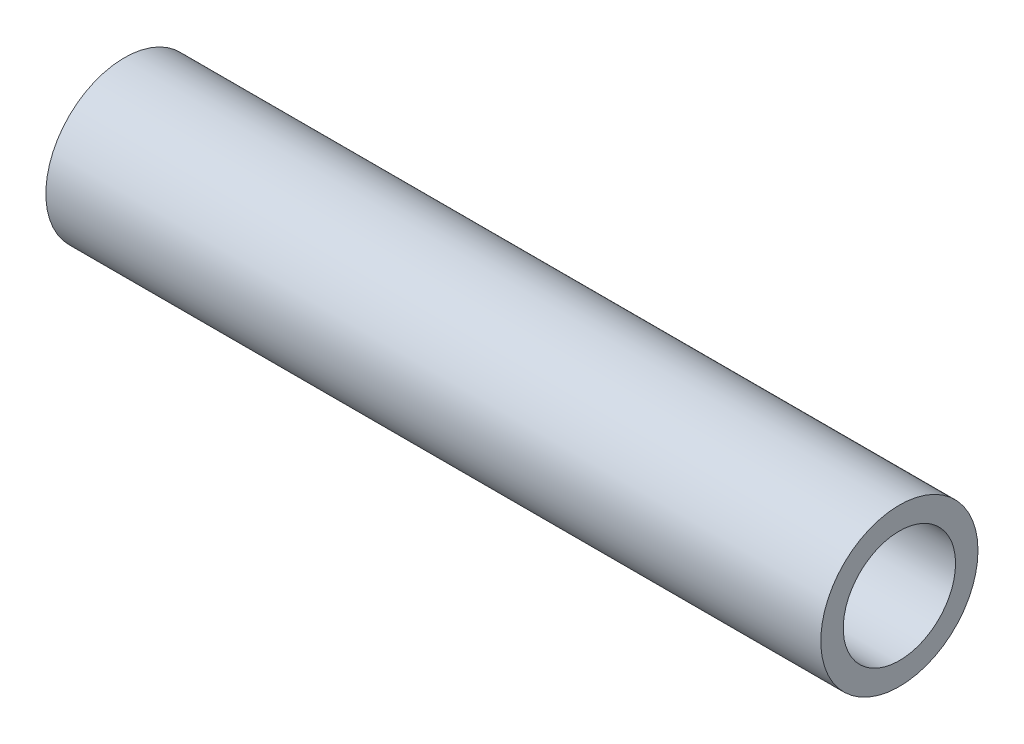
ISO-10303-21;
HEADER;
FILE_DESCRIPTION(('STEP AP214'),'2;1');
FILE_NAME('part.step','',(''),(''),'','','');
FILE_SCHEMA(('AUTOMOTIVE_DESIGN { 1 0 10303 214 1 1 1 1 }'));
ENDSEC;
DATA;
#1=APPLICATION_CONTEXT('core data for automotive mechanical design processes');
#2=APPLICATION_PROTOCOL_DEFINITION('international standard','automotive_design',2000,#1);
#3=PRODUCT_CONTEXT('',#1,'mechanical');
#4=PRODUCT('Part','Part','',(#3));
#5=PRODUCT_RELATED_PRODUCT_CATEGORY('part','',(#4));
#6=PRODUCT_DEFINITION_FORMATION('','',#4);
#7=PRODUCT_DEFINITION_CONTEXT('part definition',#1,'design');
#8=PRODUCT_DEFINITION('design','',#6,#7);
#9=PRODUCT_DEFINITION_SHAPE('','',#8);
#10=(LENGTH_UNIT() NAMED_UNIT(*) SI_UNIT(.MILLI.,.METRE.));
#11=(NAMED_UNIT(*) PLANE_ANGLE_UNIT() SI_UNIT($,.RADIAN.));
#12=(NAMED_UNIT(*) SI_UNIT($,.STERADIAN.) SOLID_ANGLE_UNIT());
#13=UNCERTAINTY_MEASURE_WITH_UNIT(LENGTH_MEASURE(1.E-05),#10,'distance_accuracy_value','');
#14=(GEOMETRIC_REPRESENTATION_CONTEXT(3) GLOBAL_UNCERTAINTY_ASSIGNED_CONTEXT((#13)) GLOBAL_UNIT_ASSIGNED_CONTEXT((#10,
#11,#12)) REPRESENTATION_CONTEXT('',''));
#15=CARTESIAN_POINT('',(0.,0.,0.));
#16=DIRECTION('',(0.,0.,1.));
#17=DIRECTION('',(1.,0.,0.));
#18=AXIS2_PLACEMENT_3D('',#15,#16,#17);
#19=CARTESIAN_POINT('',(69.,0.,0.));
#20=DIRECTION('',(1.,0.,0.));
#21=DIRECTION('',(0.,0.,-1.));
#22=AXIS2_PLACEMENT_3D('',#19,#20,#21);
#23=PLANE('',#22);
#24=CARTESIAN_POINT('',(69.,0.,0.));
#25=DIRECTION('',(1.,0.,0.));
#26=DIRECTION('',(0.,0.,-1.));
#27=AXIS2_PLACEMENT_3D('',#24,#25,#26);
#28=CIRCLE('',#27,7.);
#29=CARTESIAN_POINT('',(69.,0.,-7.));
#30=VERTEX_POINT('',#29);
#31=EDGE_CURVE('E10',#30,#30,#28,.T.);
#32=ORIENTED_EDGE('',*,*,#31,.T.);
#33=EDGE_LOOP('',(#32));
#34=FACE_BOUND('',#33,.T.);
#35=CARTESIAN_POINT('',(69.,0.,0.));
#36=DIRECTION('',(1.,0.,0.));
#37=DIRECTION('',(0.,0.,-1.));
#38=AXIS2_PLACEMENT_3D('',#35,#36,#37);
#39=CIRCLE('',#38,5.);
#40=CARTESIAN_POINT('',(69.,0.,-5.));
#41=VERTEX_POINT('',#40);
#42=EDGE_CURVE('E48',#41,#41,#39,.T.);
#43=ORIENTED_EDGE('',*,*,#42,.F.);
#44=EDGE_LOOP('',(#43));
#45=FACE_BOUND('',#44,.T.);
#46=ADVANCED_FACE('F37',(#34,#45),#23,.T.);
#47=CARTESIAN_POINT('',(0.,0.,0.));
#48=DIRECTION('',(1.,0.,0.));
#49=DIRECTION('',(0.,0.,-1.));
#50=AXIS2_PLACEMENT_3D('',#47,#48,#49);
#51=PLANE('',#50);
#52=CARTESIAN_POINT('',(0.,0.,0.));
#53=DIRECTION('',(1.,0.,0.));
#54=DIRECTION('',(0.,0.,-1.));
#55=AXIS2_PLACEMENT_3D('',#52,#53,#54);
#56=CIRCLE('',#55,7.);
#57=CARTESIAN_POINT('',(0.,0.,-7.));
#58=VERTEX_POINT('',#57);
#59=EDGE_CURVE('E41',#58,#58,#56,.T.);
#60=ORIENTED_EDGE('',*,*,#59,.F.);
#61=EDGE_LOOP('',(#60));
#62=FACE_BOUND('',#61,.T.);
#63=CARTESIAN_POINT('',(0.,0.,0.));
#64=DIRECTION('',(1.,0.,0.));
#65=DIRECTION('',(0.,0.,-1.));
#66=AXIS2_PLACEMENT_3D('',#63,#64,#65);
#67=CIRCLE('',#66,5.);
#68=CARTESIAN_POINT('',(0.,0.,-5.));
#69=VERTEX_POINT('',#68);
#70=EDGE_CURVE('E50',#69,#69,#67,.T.);
#71=ORIENTED_EDGE('',*,*,#70,.T.);
#72=EDGE_LOOP('',(#71));
#73=FACE_BOUND('',#72,.T.);
#74=ADVANCED_FACE('F60',(#62,#73),#51,.F.);
#75=CARTESIAN_POINT('',(69.,0.,0.));
#76=DIRECTION('',(-1.,0.,0.));
#77=DIRECTION('',(0.,0.,1.));
#78=AXIS2_PLACEMENT_3D('',#75,#76,#77);
#79=CYLINDRICAL_SURFACE('',#78,7.);
#80=ORIENTED_EDGE('',*,*,#31,.F.);
#81=EDGE_LOOP('',(#80));
#82=FACE_BOUND('',#81,.T.);
#83=ORIENTED_EDGE('',*,*,#59,.T.);
#84=EDGE_LOOP('',(#83));
#85=FACE_BOUND('',#84,.T.);
#86=ADVANCED_FACE('F39',(#82,#85),#79,.T.);
#87=CARTESIAN_POINT('',(69.,0.,0.));
#88=DIRECTION('',(-1.,0.,0.));
#89=DIRECTION('',(0.,0.,1.));
#90=AXIS2_PLACEMENT_3D('',#87,#88,#89);
#91=CYLINDRICAL_SURFACE('',#90,5.);
#92=ORIENTED_EDGE('',*,*,#42,.T.);
#93=EDGE_LOOP('',(#92));
#94=FACE_BOUND('',#93,.T.);
#95=ORIENTED_EDGE('',*,*,#70,.F.);
#96=EDGE_LOOP('',(#95));
#97=FACE_BOUND('',#96,.T.);
#98=ADVANCED_FACE('F56',(#94,#97),#91,.F.);
#99=CLOSED_SHELL('',(#46,#74,#86,#98));
#100=MANIFOLD_SOLID_BREP('B2',#99);
#101=ADVANCED_BREP_SHAPE_REPRESENTATION('',(#18,#100),#14);
#102=SHAPE_DEFINITION_REPRESENTATION(#9,#101);
ENDSEC;
END-ISO-10303-21;
